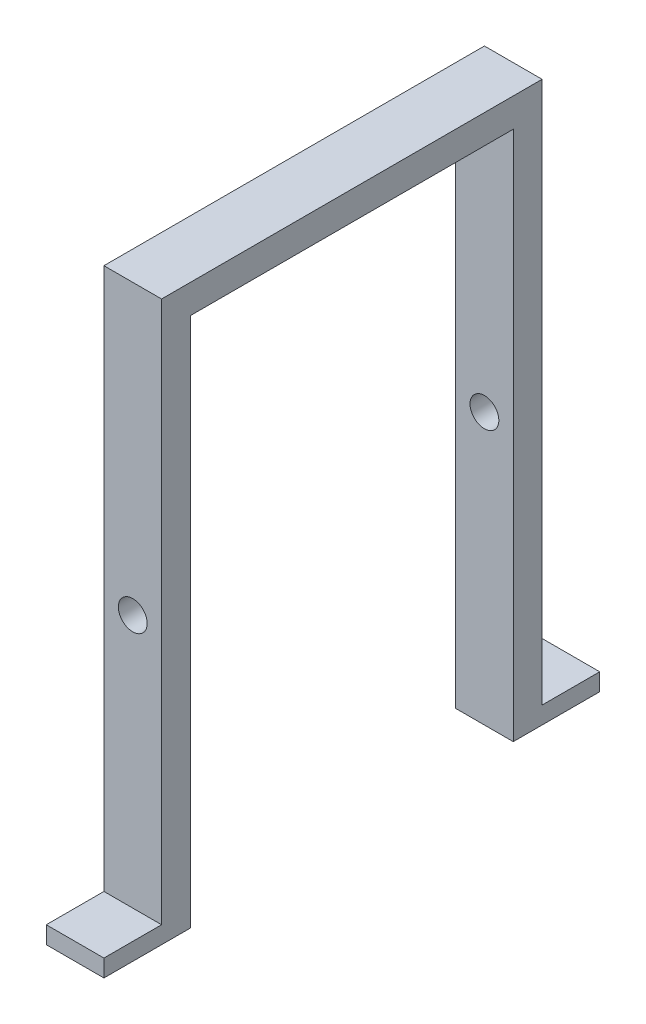
ISO-10303-21;
HEADER;
FILE_DESCRIPTION(('STEP AP214'),'2;1');
FILE_NAME('part.step','',(''),(''),'','','');
FILE_SCHEMA(('AUTOMOTIVE_DESIGN { 1 0 10303 214 1 1 1 1 }'));
ENDSEC;
DATA;
#1=APPLICATION_CONTEXT('core data for automotive mechanical design processes');
#2=APPLICATION_PROTOCOL_DEFINITION('international standard','automotive_design',2000,#1);
#3=PRODUCT_CONTEXT('',#1,'mechanical');
#4=PRODUCT('Part','Part','',(#3));
#5=PRODUCT_RELATED_PRODUCT_CATEGORY('part','',(#4));
#6=PRODUCT_DEFINITION_FORMATION('','',#4);
#7=PRODUCT_DEFINITION_CONTEXT('part definition',#1,'design');
#8=PRODUCT_DEFINITION('design','',#6,#7);
#9=PRODUCT_DEFINITION_SHAPE('','',#8);
#10=(LENGTH_UNIT() NAMED_UNIT(*) SI_UNIT(.MILLI.,.METRE.));
#11=(NAMED_UNIT(*) PLANE_ANGLE_UNIT() SI_UNIT($,.RADIAN.));
#12=(NAMED_UNIT(*) SI_UNIT($,.STERADIAN.) SOLID_ANGLE_UNIT());
#13=UNCERTAINTY_MEASURE_WITH_UNIT(LENGTH_MEASURE(1.E-05),#10,'distance_accuracy_value','');
#14=(GEOMETRIC_REPRESENTATION_CONTEXT(3) GLOBAL_UNCERTAINTY_ASSIGNED_CONTEXT((#13)) GLOBAL_UNIT_ASSIGNED_CONTEXT((#10,
#11,#12)) REPRESENTATION_CONTEXT('',''));
#15=CARTESIAN_POINT('',(0.,0.,0.));
#16=DIRECTION('',(0.,0.,1.));
#17=DIRECTION('',(1.,0.,0.));
#18=AXIS2_PLACEMENT_3D('',#15,#16,#17);
#19=CARTESIAN_POINT('',(-5.,2.99999999999999,43.));
#20=DIRECTION('',(0.,0.,1.));
#21=DIRECTION('',(1.,0.,0.));
#22=AXIS2_PLACEMENT_3D('',#19,#20,#21);
#23=PLANE('',#22);
#24=DIRECTION('',(1.,0.,0.));
#25=VECTOR('',#24,1.);
#26=CARTESIAN_POINT('',(-5.,0.,43.));
#27=LINE('',#26,#25);
#28=CARTESIAN_POINT('',(-5.,0.,43.));
#29=VERTEX_POINT('',#28);
#30=CARTESIAN_POINT('',(5.,0.,43.));
#31=VERTEX_POINT('',#30);
#32=EDGE_CURVE('E11',#29,#31,#27,.T.);
#33=ORIENTED_EDGE('',*,*,#32,.T.);
#34=DIRECTION('',(0.,-1.,0.));
#35=VECTOR('',#34,1.);
#36=CARTESIAN_POINT('',(5.,2.99999999999999,43.));
#37=LINE('',#36,#35);
#38=CARTESIAN_POINT('',(5.,2.99999999999999,43.));
#39=VERTEX_POINT('',#38);
#40=EDGE_CURVE('E140',#39,#31,#37,.T.);
#41=ORIENTED_EDGE('',*,*,#40,.F.);
#42=DIRECTION('',(1.,0.,0.));
#43=VECTOR('',#42,1.);
#44=CARTESIAN_POINT('',(-5.,2.99999999999999,43.));
#45=LINE('',#44,#43);
#46=CARTESIAN_POINT('',(-5.,2.99999999999999,43.));
#47=VERTEX_POINT('',#46);
#48=EDGE_CURVE('E44',#47,#39,#45,.T.);
#49=ORIENTED_EDGE('',*,*,#48,.F.);
#50=DIRECTION('',(0.,-1.,0.));
#51=VECTOR('',#50,1.);
#52=CARTESIAN_POINT('',(-5.,2.99999999999999,43.));
#53=LINE('',#52,#51);
#54=EDGE_CURVE('E131',#47,#29,#53,.T.);
#55=ORIENTED_EDGE('',*,*,#54,.T.);
#56=EDGE_LOOP('',(#33,#41,#49,#55));
#57=FACE_BOUND('',#56,.T.);
#58=ADVANCED_FACE('F35',(#57),#23,.T.);
#59=CARTESIAN_POINT('',(-5.,2.99999999999999,33.));
#60=DIRECTION('',(0.,1.,0.));
#61=DIRECTION('',(0.,0.,1.));
#62=AXIS2_PLACEMENT_3D('',#59,#60,#61);
#63=PLANE('',#62);
#64=ORIENTED_EDGE('',*,*,#48,.T.);
#65=DIRECTION('',(0.,0.,1.));
#66=VECTOR('',#65,1.);
#67=CARTESIAN_POINT('',(5.,2.99999999999999,33.));
#68=LINE('',#67,#66);
#69=CARTESIAN_POINT('',(5.,2.99999999999999,33.));
#70=VERTEX_POINT('',#69);
#71=EDGE_CURVE('E170',#70,#39,#68,.T.);
#72=ORIENTED_EDGE('',*,*,#71,.F.);
#73=DIRECTION('',(1.,0.,0.));
#74=VECTOR('',#73,1.);
#75=CARTESIAN_POINT('',(-5.,2.99999999999999,33.));
#76=LINE('',#75,#74);
#77=CARTESIAN_POINT('',(-5.,2.99999999999999,33.));
#78=VERTEX_POINT('',#77);
#79=EDGE_CURVE('E203',#78,#70,#76,.T.);
#80=ORIENTED_EDGE('',*,*,#79,.F.);
#81=DIRECTION('',(0.,0.,1.));
#82=VECTOR('',#81,1.);
#83=CARTESIAN_POINT('',(-5.,2.99999999999999,33.));
#84=LINE('',#83,#82);
#85=EDGE_CURVE('E199',#78,#47,#84,.T.);
#86=ORIENTED_EDGE('',*,*,#85,.T.);
#87=EDGE_LOOP('',(#64,#72,#80,#86));
#88=FACE_BOUND('',#87,.T.);
#89=ADVANCED_FACE('F256',(#88),#63,.T.);
#90=CARTESIAN_POINT('',(-5.,2.99999999999999,33.));
#91=DIRECTION('',(0.,0.,1.));
#92=DIRECTION('',(1.,0.,0.));
#93=AXIS2_PLACEMENT_3D('',#90,#91,#92);
#94=PLANE('',#93);
#95=CARTESIAN_POINT('',(0.,47.,33.));
#96=DIRECTION('',(0.,0.,1.));
#97=DIRECTION('',(1.,0.,0.));
#98=AXIS2_PLACEMENT_3D('',#95,#96,#97);
#99=CIRCLE('',#98,2.5);
#100=CARTESIAN_POINT('',(2.5,47.,33.));
#101=VERTEX_POINT('',#100);
#102=EDGE_CURVE('E294',#101,#101,#99,.T.);
#103=ORIENTED_EDGE('',*,*,#102,.F.);
#104=EDGE_LOOP('',(#103));
#105=FACE_BOUND('',#104,.T.);
#106=ORIENTED_EDGE('',*,*,#79,.T.);
#107=DIRECTION('',(0.,-1.,0.));
#108=VECTOR('',#107,1.);
#109=CARTESIAN_POINT('',(5.,2.99999999999999,33.));
#110=LINE('',#109,#108);
#111=CARTESIAN_POINT('',(5.,97.,33.));
#112=VERTEX_POINT('',#111);
#113=EDGE_CURVE('E167',#112,#70,#110,.T.);
#114=ORIENTED_EDGE('',*,*,#113,.F.);
#115=DIRECTION('',(1.,0.,0.));
#116=VECTOR('',#115,1.);
#117=CARTESIAN_POINT('',(-5.,97.,33.));
#118=LINE('',#117,#116);
#119=CARTESIAN_POINT('',(-5.,97.,33.));
#120=VERTEX_POINT('',#119);
#121=EDGE_CURVE('E205',#120,#112,#118,.T.);
#122=ORIENTED_EDGE('',*,*,#121,.F.);
#123=DIRECTION('',(0.,-1.,0.));
#124=VECTOR('',#123,1.);
#125=CARTESIAN_POINT('',(-5.,2.99999999999999,33.));
#126=LINE('',#125,#124);
#127=EDGE_CURVE('E196',#120,#78,#126,.T.);
#128=ORIENTED_EDGE('',*,*,#127,.T.);
#129=EDGE_LOOP('',(#106,#114,#122,#128));
#130=FACE_BOUND('',#129,.T.);
#131=ADVANCED_FACE('F254',(#105,#130),#94,.T.);
#132=CARTESIAN_POINT('',(-5.,97.,33.));
#133=DIRECTION('',(0.,1.,0.));
#134=DIRECTION('',(0.,0.,1.));
#135=AXIS2_PLACEMENT_3D('',#132,#133,#134);
#136=PLANE('',#135);
#137=ORIENTED_EDGE('',*,*,#121,.T.);
#138=DIRECTION('',(0.,0.,1.));
#139=VECTOR('',#138,1.);
#140=CARTESIAN_POINT('',(5.,97.,33.));
#141=LINE('',#140,#139);
#142=CARTESIAN_POINT('',(5.,97.,-33.));
#143=VERTEX_POINT('',#142);
#144=EDGE_CURVE('E164',#143,#112,#141,.T.);
#145=ORIENTED_EDGE('',*,*,#144,.F.);
#146=DIRECTION('',(1.,0.,0.));
#147=VECTOR('',#146,1.);
#148=CARTESIAN_POINT('',(-5.,97.,-33.));
#149=LINE('',#148,#147);
#150=CARTESIAN_POINT('',(-5.,97.,-33.));
#151=VERTEX_POINT('',#150);
#152=EDGE_CURVE('E207',#151,#143,#149,.T.);
#153=ORIENTED_EDGE('',*,*,#152,.F.);
#154=DIRECTION('',(0.,0.,1.));
#155=VECTOR('',#154,1.);
#156=CARTESIAN_POINT('',(-5.,97.,33.));
#157=LINE('',#156,#155);
#158=EDGE_CURVE('E193',#151,#120,#157,.T.);
#159=ORIENTED_EDGE('',*,*,#158,.T.);
#160=EDGE_LOOP('',(#137,#145,#153,#159));
#161=FACE_BOUND('',#160,.T.);
#162=ADVANCED_FACE('F249',(#161),#136,.T.);
#163=CARTESIAN_POINT('',(-5.,97.,-33.));
#164=DIRECTION('',(0.,0.,-1.));
#165=DIRECTION('',(-1.,0.,0.));
#166=AXIS2_PLACEMENT_3D('',#163,#164,#165);
#167=PLANE('',#166);
#168=CARTESIAN_POINT('',(0.,47.,-33.));
#169=DIRECTION('',(0.,0.,-1.));
#170=DIRECTION('',(-1.,0.,0.));
#171=AXIS2_PLACEMENT_3D('',#168,#169,#170);
#172=CIRCLE('',#171,2.5);
#173=CARTESIAN_POINT('',(-2.5,47.,-33.));
#174=VERTEX_POINT('',#173);
#175=EDGE_CURVE('E141',#174,#174,#172,.T.);
#176=ORIENTED_EDGE('',*,*,#175,.F.);
#177=EDGE_LOOP('',(#176));
#178=FACE_BOUND('',#177,.T.);
#179=ORIENTED_EDGE('',*,*,#152,.T.);
#180=DIRECTION('',(0.,1.,0.));
#181=VECTOR('',#180,1.);
#182=CARTESIAN_POINT('',(5.,97.,-33.));
#183=LINE('',#182,#181);
#184=CARTESIAN_POINT('',(5.,2.99999999999999,-33.));
#185=VERTEX_POINT('',#184);
#186=EDGE_CURVE('E161',#185,#143,#183,.T.);
#187=ORIENTED_EDGE('',*,*,#186,.F.);
#188=DIRECTION('',(1.,0.,0.));
#189=VECTOR('',#188,1.);
#190=CARTESIAN_POINT('',(-5.,2.99999999999999,-33.));
#191=LINE('',#190,#189);
#192=CARTESIAN_POINT('',(-5.,2.99999999999999,-33.));
#193=VERTEX_POINT('',#192);
#194=EDGE_CURVE('E209',#193,#185,#191,.T.);
#195=ORIENTED_EDGE('',*,*,#194,.F.);
#196=DIRECTION('',(0.,1.,0.));
#197=VECTOR('',#196,1.);
#198=CARTESIAN_POINT('',(-5.,97.,-33.));
#199=LINE('',#198,#197);
#200=EDGE_CURVE('E190',#193,#151,#199,.T.);
#201=ORIENTED_EDGE('',*,*,#200,.T.);
#202=EDGE_LOOP('',(#179,#187,#195,#201));
#203=FACE_BOUND('',#202,.T.);
#204=ADVANCED_FACE('F244',(#178,#203),#167,.T.);
#205=CARTESIAN_POINT('',(-5.,2.99999999999999,-33.));
#206=DIRECTION('',(0.,1.,0.));
#207=DIRECTION('',(0.,0.,1.));
#208=AXIS2_PLACEMENT_3D('',#205,#206,#207);
#209=PLANE('',#208);
#210=ORIENTED_EDGE('',*,*,#194,.T.);
#211=DIRECTION('',(0.,0.,1.));
#212=VECTOR('',#211,1.);
#213=CARTESIAN_POINT('',(5.,2.99999999999999,-33.));
#214=LINE('',#213,#212);
#215=CARTESIAN_POINT('',(5.,2.99999999999999,-43.));
#216=VERTEX_POINT('',#215);
#217=EDGE_CURVE('E158',#216,#185,#214,.T.);
#218=ORIENTED_EDGE('',*,*,#217,.F.);
#219=DIRECTION('',(1.,0.,0.));
#220=VECTOR('',#219,1.);
#221=CARTESIAN_POINT('',(-5.,2.99999999999999,-43.));
#222=LINE('',#221,#220);
#223=CARTESIAN_POINT('',(-5.,2.99999999999999,-43.));
#224=VERTEX_POINT('',#223);
#225=EDGE_CURVE('E211',#224,#216,#222,.T.);
#226=ORIENTED_EDGE('',*,*,#225,.F.);
#227=DIRECTION('',(0.,0.,1.));
#228=VECTOR('',#227,1.);
#229=CARTESIAN_POINT('',(-5.,2.99999999999999,-33.));
#230=LINE('',#229,#228);
#231=EDGE_CURVE('E187',#224,#193,#230,.T.);
#232=ORIENTED_EDGE('',*,*,#231,.T.);
#233=EDGE_LOOP('',(#210,#218,#226,#232));
#234=FACE_BOUND('',#233,.T.);
#235=ADVANCED_FACE('F242',(#234),#209,.T.);
#236=CARTESIAN_POINT('',(-5.,2.99999999999999,-43.));
#237=DIRECTION('',(0.,0.,-1.));
#238=DIRECTION('',(-1.,0.,0.));
#239=AXIS2_PLACEMENT_3D('',#236,#237,#238);
#240=PLANE('',#239);
#241=ORIENTED_EDGE('',*,*,#225,.T.);
#242=DIRECTION('',(0.,1.,0.));
#243=VECTOR('',#242,1.);
#244=CARTESIAN_POINT('',(5.,2.99999999999999,-43.));
#245=LINE('',#244,#243);
#246=CARTESIAN_POINT('',(5.,0.,-43.));
#247=VERTEX_POINT('',#246);
#248=EDGE_CURVE('E155',#247,#216,#245,.T.);
#249=ORIENTED_EDGE('',*,*,#248,.F.);
#250=DIRECTION('',(1.,0.,0.));
#251=VECTOR('',#250,1.);
#252=CARTESIAN_POINT('',(-5.,0.,-43.));
#253=LINE('',#252,#251);
#254=CARTESIAN_POINT('',(-5.,0.,-43.));
#255=VERTEX_POINT('',#254);
#256=EDGE_CURVE('E213',#255,#247,#253,.T.);
#257=ORIENTED_EDGE('',*,*,#256,.F.);
#258=DIRECTION('',(0.,1.,0.));
#259=VECTOR('',#258,1.);
#260=CARTESIAN_POINT('',(-5.,2.99999999999999,-43.));
#261=LINE('',#260,#259);
#262=EDGE_CURVE('E184',#255,#224,#261,.T.);
#263=ORIENTED_EDGE('',*,*,#262,.T.);
#264=EDGE_LOOP('',(#241,#249,#257,#263));
#265=FACE_BOUND('',#264,.T.);
#266=ADVANCED_FACE('F237',(#265),#240,.T.);
#267=CARTESIAN_POINT('',(-5.,0.,-43.));
#268=DIRECTION('',(0.,-1.,0.));
#269=DIRECTION('',(0.,0.,-1.));
#270=AXIS2_PLACEMENT_3D('',#267,#268,#269);
#271=PLANE('',#270);
#272=ORIENTED_EDGE('',*,*,#256,.T.);
#273=DIRECTION('',(0.,0.,-1.));
#274=VECTOR('',#273,1.);
#275=CARTESIAN_POINT('',(5.,0.,-33.));
#276=LINE('',#275,#274);
#277=CARTESIAN_POINT('',(5.,0.,-28.));
#278=VERTEX_POINT('',#277);
#279=EDGE_CURVE('E152',#278,#247,#276,.T.);
#280=ORIENTED_EDGE('',*,*,#279,.F.);
#281=DIRECTION('',(1.,0.,0.));
#282=VECTOR('',#281,1.);
#283=CARTESIAN_POINT('',(-5.,0.,-28.));
#284=LINE('',#283,#282);
#285=CARTESIAN_POINT('',(-5.,0.,-28.));
#286=VERTEX_POINT('',#285);
#287=EDGE_CURVE('E215',#286,#278,#284,.T.);
#288=ORIENTED_EDGE('',*,*,#287,.F.);
#289=DIRECTION('',(0.,0.,-1.));
#290=VECTOR('',#289,1.);
#291=CARTESIAN_POINT('',(-5.,0.,-33.));
#292=LINE('',#291,#290);
#293=EDGE_CURVE('E182',#286,#255,#292,.T.);
#294=ORIENTED_EDGE('',*,*,#293,.T.);
#295=EDGE_LOOP('',(#272,#280,#288,#294));
#296=FACE_BOUND('',#295,.T.);
#297=ADVANCED_FACE('F229',(#296),#271,.T.);
#298=CARTESIAN_POINT('',(-5.,0.,-28.));
#299=DIRECTION('',(0.,0.,1.));
#300=DIRECTION('',(0.,-1.,0.));
#301=AXIS2_PLACEMENT_3D('',#298,#299,#300);
#302=PLANE('',#301);
#303=CARTESIAN_POINT('',(0.,47.,-28.));
#304=DIRECTION('',(0.,0.,1.));
#305=DIRECTION('',(0.,-1.,0.));
#306=AXIS2_PLACEMENT_3D('',#303,#304,#305);
#307=CIRCLE('',#306,2.5);
#308=CARTESIAN_POINT('',(0.,44.5,-28.));
#309=VERTEX_POINT('',#308);
#310=EDGE_CURVE('E293',#309,#309,#307,.T.);
#311=ORIENTED_EDGE('',*,*,#310,.F.);
#312=EDGE_LOOP('',(#311));
#313=FACE_BOUND('',#312,.T.);
#314=ORIENTED_EDGE('',*,*,#287,.T.);
#315=DIRECTION('',(0.,-1.,0.));
#316=VECTOR('',#315,1.);
#317=CARTESIAN_POINT('',(5.,0.,-28.));
#318=LINE('',#317,#316);
#319=CARTESIAN_POINT('',(5.,92.,-28.));
#320=VERTEX_POINT('',#319);
#321=EDGE_CURVE('E146',#320,#278,#318,.T.);
#322=ORIENTED_EDGE('',*,*,#321,.F.);
#323=DIRECTION('',(1.,0.,0.));
#324=VECTOR('',#323,1.);
#325=CARTESIAN_POINT('',(-5.,92.,-28.));
#326=LINE('',#325,#324);
#327=CARTESIAN_POINT('',(-5.,92.,-28.));
#328=VERTEX_POINT('',#327);
#329=EDGE_CURVE('E217',#328,#320,#326,.T.);
#330=ORIENTED_EDGE('',*,*,#329,.F.);
#331=DIRECTION('',(0.,-1.,0.));
#332=VECTOR('',#331,1.);
#333=CARTESIAN_POINT('',(-5.,0.,-28.));
#334=LINE('',#333,#332);
#335=EDGE_CURVE('E179',#328,#286,#334,.T.);
#336=ORIENTED_EDGE('',*,*,#335,.T.);
#337=EDGE_LOOP('',(#314,#322,#330,#336));
#338=FACE_BOUND('',#337,.T.);
#339=ADVANCED_FACE('F226',(#313,#338),#302,.T.);
#340=CARTESIAN_POINT('',(-5.,92.,-28.));
#341=DIRECTION('',(0.,-1.,0.));
#342=DIRECTION('',(0.,0.,-1.));
#343=AXIS2_PLACEMENT_3D('',#340,#341,#342);
#344=PLANE('',#343);
#345=ORIENTED_EDGE('',*,*,#329,.T.);
#346=DIRECTION('',(0.,0.,-1.));
#347=VECTOR('',#346,1.);
#348=CARTESIAN_POINT('',(5.,92.,-28.));
#349=LINE('',#348,#347);
#350=CARTESIAN_POINT('',(5.,92.,28.));
#351=VERTEX_POINT('',#350);
#352=EDGE_CURVE('E144',#351,#320,#349,.T.);
#353=ORIENTED_EDGE('',*,*,#352,.F.);
#354=DIRECTION('',(1.,0.,0.));
#355=VECTOR('',#354,1.);
#356=CARTESIAN_POINT('',(-5.,92.,28.));
#357=LINE('',#356,#355);
#358=CARTESIAN_POINT('',(-5.,92.,28.));
#359=VERTEX_POINT('',#358);
#360=EDGE_CURVE('E130',#359,#351,#357,.T.);
#361=ORIENTED_EDGE('',*,*,#360,.F.);
#362=DIRECTION('',(0.,0.,-1.));
#363=VECTOR('',#362,1.);
#364=CARTESIAN_POINT('',(-5.,92.,-28.));
#365=LINE('',#364,#363);
#366=EDGE_CURVE('E176',#359,#328,#365,.T.);
#367=ORIENTED_EDGE('',*,*,#366,.T.);
#368=EDGE_LOOP('',(#345,#353,#361,#367));
#369=FACE_BOUND('',#368,.T.);
#370=ADVANCED_FACE('F220',(#369),#344,.T.);
#371=CARTESIAN_POINT('',(-5.,92.,28.));
#372=DIRECTION('',(0.,0.,-1.));
#373=DIRECTION('',(0.,1.,0.));
#374=AXIS2_PLACEMENT_3D('',#371,#372,#373);
#375=PLANE('',#374);
#376=CARTESIAN_POINT('',(0.,47.,28.));
#377=DIRECTION('',(0.,0.,-1.));
#378=DIRECTION('',(0.,1.,0.));
#379=AXIS2_PLACEMENT_3D('',#376,#377,#378);
#380=CIRCLE('',#379,2.5);
#381=CARTESIAN_POINT('',(0.,49.5,28.));
#382=VERTEX_POINT('',#381);
#383=EDGE_CURVE('E39',#382,#382,#380,.T.);
#384=ORIENTED_EDGE('',*,*,#383,.F.);
#385=EDGE_LOOP('',(#384));
#386=FACE_BOUND('',#385,.T.);
#387=ORIENTED_EDGE('',*,*,#360,.T.);
#388=DIRECTION('',(0.,1.,0.));
#389=VECTOR('',#388,1.);
#390=CARTESIAN_POINT('',(5.,92.,28.));
#391=LINE('',#390,#389);
#392=CARTESIAN_POINT('',(5.,0.,28.));
#393=VERTEX_POINT('',#392);
#394=EDGE_CURVE('E137',#393,#351,#391,.T.);
#395=ORIENTED_EDGE('',*,*,#394,.F.);
#396=DIRECTION('',(1.,0.,0.));
#397=VECTOR('',#396,1.);
#398=CARTESIAN_POINT('',(-5.,0.,28.));
#399=LINE('',#398,#397);
#400=CARTESIAN_POINT('',(-5.,0.,28.));
#401=VERTEX_POINT('',#400);
#402=EDGE_CURVE('E122',#401,#393,#399,.T.);
#403=ORIENTED_EDGE('',*,*,#402,.F.);
#404=DIRECTION('',(0.,1.,0.));
#405=VECTOR('',#404,1.);
#406=CARTESIAN_POINT('',(-5.,92.,28.));
#407=LINE('',#406,#405);
#408=EDGE_CURVE('E174',#401,#359,#407,.T.);
#409=ORIENTED_EDGE('',*,*,#408,.T.);
#410=EDGE_LOOP('',(#387,#395,#403,#409));
#411=FACE_BOUND('',#410,.T.);
#412=ADVANCED_FACE('F143',(#386,#411),#375,.T.);
#413=CARTESIAN_POINT('',(-5.,0.,33.));
#414=DIRECTION('',(0.,-1.,0.));
#415=DIRECTION('',(0.,0.,-1.));
#416=AXIS2_PLACEMENT_3D('',#413,#414,#415);
#417=PLANE('',#416);
#418=ORIENTED_EDGE('',*,*,#402,.T.);
#419=DIRECTION('',(0.,0.,-1.));
#420=VECTOR('',#419,1.);
#421=CARTESIAN_POINT('',(5.,0.,43.));
#422=LINE('',#421,#420);
#423=EDGE_CURVE('E124',#31,#393,#422,.T.);
#424=ORIENTED_EDGE('',*,*,#423,.F.);
#425=ORIENTED_EDGE('',*,*,#32,.F.);
#426=DIRECTION('',(0.,0.,-1.));
#427=VECTOR('',#426,1.);
#428=CARTESIAN_POINT('',(-5.,0.,43.));
#429=LINE('',#428,#427);
#430=EDGE_CURVE('E125',#29,#401,#429,.T.);
#431=ORIENTED_EDGE('',*,*,#430,.T.);
#432=EDGE_LOOP('',(#418,#424,#425,#431));
#433=FACE_BOUND('',#432,.T.);
#434=ADVANCED_FACE('F37',(#433),#417,.T.);
#435=CARTESIAN_POINT('',(-5.,0.,0.));
#436=DIRECTION('',(-1.,0.,0.));
#437=DIRECTION('',(0.,0.,1.));
#438=AXIS2_PLACEMENT_3D('',#435,#436,#437);
#439=PLANE('',#438);
#440=ORIENTED_EDGE('',*,*,#430,.F.);
#441=ORIENTED_EDGE('',*,*,#54,.F.);
#442=ORIENTED_EDGE('',*,*,#85,.F.);
#443=ORIENTED_EDGE('',*,*,#127,.F.);
#444=ORIENTED_EDGE('',*,*,#158,.F.);
#445=ORIENTED_EDGE('',*,*,#200,.F.);
#446=ORIENTED_EDGE('',*,*,#231,.F.);
#447=ORIENTED_EDGE('',*,*,#262,.F.);
#448=ORIENTED_EDGE('',*,*,#293,.F.);
#449=ORIENTED_EDGE('',*,*,#335,.F.);
#450=ORIENTED_EDGE('',*,*,#366,.F.);
#451=ORIENTED_EDGE('',*,*,#408,.F.);
#452=EDGE_LOOP('',(#440,#441,#442,#443,#444,#445,#446,#447,#448,#449,#450,#451));
#453=FACE_BOUND('',#452,.T.);
#454=ADVANCED_FACE('F233',(#453),#439,.T.);
#455=CARTESIAN_POINT('',(5.,0.,0.));
#456=DIRECTION('',(-1.,0.,0.));
#457=DIRECTION('',(0.,0.,1.));
#458=AXIS2_PLACEMENT_3D('',#455,#456,#457);
#459=PLANE('',#458);
#460=ORIENTED_EDGE('',*,*,#423,.T.);
#461=ORIENTED_EDGE('',*,*,#394,.T.);
#462=ORIENTED_EDGE('',*,*,#352,.T.);
#463=ORIENTED_EDGE('',*,*,#321,.T.);
#464=ORIENTED_EDGE('',*,*,#279,.T.);
#465=ORIENTED_EDGE('',*,*,#248,.T.);
#466=ORIENTED_EDGE('',*,*,#217,.T.);
#467=ORIENTED_EDGE('',*,*,#186,.T.);
#468=ORIENTED_EDGE('',*,*,#144,.T.);
#469=ORIENTED_EDGE('',*,*,#113,.T.);
#470=ORIENTED_EDGE('',*,*,#71,.T.);
#471=ORIENTED_EDGE('',*,*,#40,.T.);
#472=EDGE_LOOP('',(#460,#461,#462,#463,#464,#465,#466,#467,#468,#469,#470,#471));
#473=FACE_BOUND('',#472,.T.);
#474=ADVANCED_FACE('F135',(#473),#459,.F.);
#475=CARTESIAN_POINT('',(0.,47.,-43.));
#476=DIRECTION('',(0.,0.,1.));
#477=DIRECTION('',(1.,0.,0.));
#478=AXIS2_PLACEMENT_3D('',#475,#476,#477);
#479=CYLINDRICAL_SURFACE('',#478,2.5);
#480=ORIENTED_EDGE('',*,*,#383,.T.);
#481=EDGE_LOOP('',(#480));
#482=FACE_BOUND('',#481,.T.);
#483=ORIENTED_EDGE('',*,*,#102,.T.);
#484=EDGE_LOOP('',(#483));
#485=FACE_BOUND('',#484,.T.);
#486=ADVANCED_FACE('F307',(#482,#485),#479,.F.);
#487=ORIENTED_EDGE('',*,*,#175,.T.);
#488=EDGE_LOOP('',(#487));
#489=FACE_BOUND('',#488,.T.);
#490=ORIENTED_EDGE('',*,*,#310,.T.);
#491=EDGE_LOOP('',(#490));
#492=FACE_BOUND('',#491,.T.);
#493=ADVANCED_FACE('F304',(#489,#492),#479,.F.);
#494=CLOSED_SHELL('',(#58,#89,#131,#162,#204,#235,#266,#297,#339,#370,#412,#434,#454,#474,#486,#493));
#495=MANIFOLD_SOLID_BREP('B2',#494);
#496=ADVANCED_BREP_SHAPE_REPRESENTATION('',(#18,#495),#14);
#497=SHAPE_DEFINITION_REPRESENTATION(#9,#496);
ENDSEC;
END-ISO-10303-21;
